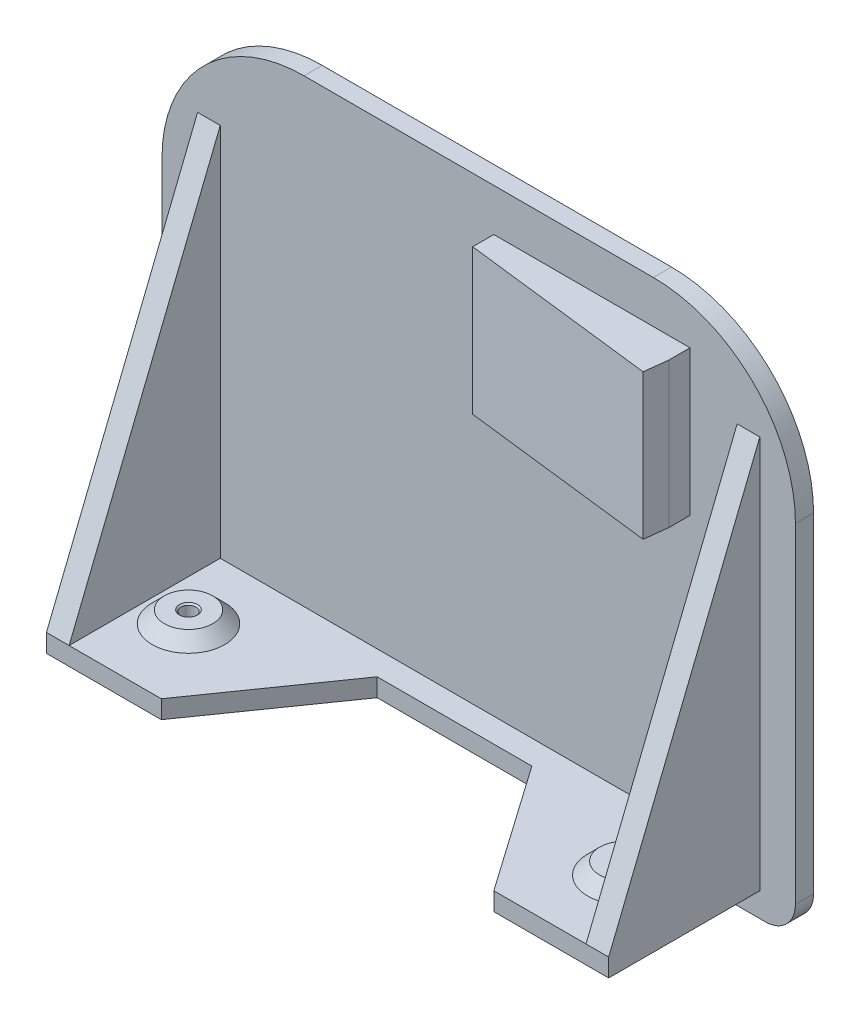
ISO-10303-21;
HEADER;
FILE_DESCRIPTION(('STEP AP214'),'2;1');
FILE_NAME('part.step','',(''),(''),'','','');
FILE_SCHEMA(('AUTOMOTIVE_DESIGN { 1 0 10303 214 1 1 1 1 }'));
ENDSEC;
DATA;
#1=APPLICATION_CONTEXT('core data for automotive mechanical design processes');
#2=APPLICATION_PROTOCOL_DEFINITION('international standard','automotive_design',2000,#1);
#3=PRODUCT_CONTEXT('',#1,'mechanical');
#4=PRODUCT('Part','Part','',(#3));
#5=PRODUCT_RELATED_PRODUCT_CATEGORY('part','',(#4));
#6=PRODUCT_DEFINITION_FORMATION('','',#4);
#7=PRODUCT_DEFINITION_CONTEXT('part definition',#1,'design');
#8=PRODUCT_DEFINITION('design','',#6,#7);
#9=PRODUCT_DEFINITION_SHAPE('','',#8);
#10=(LENGTH_UNIT() NAMED_UNIT(*) SI_UNIT(.MILLI.,.METRE.));
#11=(NAMED_UNIT(*) PLANE_ANGLE_UNIT() SI_UNIT($,.RADIAN.));
#12=(NAMED_UNIT(*) SI_UNIT($,.STERADIAN.) SOLID_ANGLE_UNIT());
#13=UNCERTAINTY_MEASURE_WITH_UNIT(LENGTH_MEASURE(1.E-05),#10,'distance_accuracy_value','');
#14=(GEOMETRIC_REPRESENTATION_CONTEXT(3) GLOBAL_UNCERTAINTY_ASSIGNED_CONTEXT((#13)) GLOBAL_UNIT_ASSIGNED_CONTEXT((#10,
#11,#12)) REPRESENTATION_CONTEXT('',''));
#15=CARTESIAN_POINT('',(0.,0.,0.));
#16=DIRECTION('',(0.,0.,1.));
#17=DIRECTION('',(1.,0.,0.));
#18=AXIS2_PLACEMENT_3D('',#15,#16,#17);
#19=CARTESIAN_POINT('',(-47.3875,-32.,3.));
#20=DIRECTION('',(0.,0.,1.));
#21=DIRECTION('',(1.,0.,0.));
#22=AXIS2_PLACEMENT_3D('',#19,#20,#21);
#23=PLANE('',#22);
#24=DIRECTION('',(0.,-1.,0.));
#25=VECTOR('',#24,1.);
#26=CARTESIAN_POINT('',(-52.3875,0.,3.));
#27=LINE('',#26,#25);
#28=CARTESIAN_POINT('',(-52.3875,22.5375,3.));
#29=VERTEX_POINT('',#28);
#30=CARTESIAN_POINT('',(-52.3875,-32.,3.));
#31=VERTEX_POINT('',#30);
#32=EDGE_CURVE('E348',#29,#31,#27,.T.);
#33=ORIENTED_EDGE('',*,*,#32,.T.);
#34=CARTESIAN_POINT('',(-47.3875,-32.,3.));
#35=DIRECTION('',(0.,0.,1.));
#36=DIRECTION('',(1.,0.,0.));
#37=AXIS2_PLACEMENT_3D('',#34,#35,#36);
#38=CIRCLE('',#37,4.99999999999999);
#39=CARTESIAN_POINT('',(-47.3875,-37.,3.));
#40=VERTEX_POINT('',#39);
#41=EDGE_CURVE('E351',#31,#40,#38,.T.);
#42=ORIENTED_EDGE('',*,*,#41,.T.);
#43=DIRECTION('',(1.,0.,0.));
#44=VECTOR('',#43,1.);
#45=CARTESIAN_POINT('',(-47.3875,-37.,3.));
#46=LINE('',#45,#44);
#47=CARTESIAN_POINT('',(47.3875,-37.,3.));
#48=VERTEX_POINT('',#47);
#49=EDGE_CURVE('E354',#40,#48,#46,.T.);
#50=ORIENTED_EDGE('',*,*,#49,.T.);
#51=CARTESIAN_POINT('',(47.3875,-32.,3.));
#52=DIRECTION('',(0.,0.,1.));
#53=DIRECTION('',(-1.,0.,0.));
#54=AXIS2_PLACEMENT_3D('',#51,#52,#53);
#55=CIRCLE('',#54,4.99999999999999);
#56=CARTESIAN_POINT('',(52.3875,-32.,3.));
#57=VERTEX_POINT('',#56);
#58=EDGE_CURVE('E356',#48,#57,#55,.T.);
#59=ORIENTED_EDGE('',*,*,#58,.T.);
#60=DIRECTION('',(0.,1.,0.));
#61=VECTOR('',#60,1.);
#62=CARTESIAN_POINT('',(52.3875,0.,3.));
#63=LINE('',#62,#61);
#64=CARTESIAN_POINT('',(52.3875,22.5375,3.));
#65=VERTEX_POINT('',#64);
#66=EDGE_CURVE('E358',#57,#65,#63,.T.);
#67=ORIENTED_EDGE('',*,*,#66,.T.);
#68=CARTESIAN_POINT('',(28.8875,22.5375,3.));
#69=DIRECTION('',(0.,0.,1.));
#70=DIRECTION('',(-1.,0.,0.));
#71=AXIS2_PLACEMENT_3D('',#68,#69,#70);
#72=CIRCLE('',#71,23.5);
#73=CARTESIAN_POINT('',(28.8875,46.0375,3.));
#74=VERTEX_POINT('',#73);
#75=EDGE_CURVE('E360',#65,#74,#72,.T.);
#76=ORIENTED_EDGE('',*,*,#75,.T.);
#77=DIRECTION('',(-1.,0.,0.));
#78=VECTOR('',#77,1.);
#79=CARTESIAN_POINT('',(-28.8875,46.0375,3.));
#80=LINE('',#79,#78);
#81=CARTESIAN_POINT('',(-28.8875,46.0375,3.));
#82=VERTEX_POINT('',#81);
#83=EDGE_CURVE('E362',#74,#82,#80,.T.);
#84=ORIENTED_EDGE('',*,*,#83,.T.);
#85=CARTESIAN_POINT('',(-28.8875,22.5375,3.));
#86=DIRECTION('',(0.,0.,1.));
#87=DIRECTION('',(1.,0.,0.));
#88=AXIS2_PLACEMENT_3D('',#85,#86,#87);
#89=CIRCLE('',#88,23.5);
#90=EDGE_CURVE('E364',#82,#29,#89,.T.);
#91=ORIENTED_EDGE('',*,*,#90,.T.);
#92=EDGE_LOOP('',(#33,#42,#50,#59,#67,#76,#84,#91));
#93=FACE_BOUND('',#92,.T.);
#94=DIRECTION('',(-1.,0.,0.));
#95=VECTOR('',#94,1.);
#96=CARTESIAN_POINT('',(46.5,-33.,2.99999999999999));
#97=LINE('',#96,#95);
#98=CARTESIAN_POINT('',(46.5,-33.,2.99999999999999));
#99=VERTEX_POINT('',#98);
#100=CARTESIAN_POINT('',(-46.5,-33.,2.99999999999999));
#101=VERTEX_POINT('',#100);
#102=EDGE_CURVE('E336',#99,#101,#97,.T.);
#103=ORIENTED_EDGE('',*,*,#102,.T.);
#104=DIRECTION('',(0.,1.,0.));
#105=VECTOR('',#104,1.);
#106=CARTESIAN_POINT('',(-46.5,32.,3.));
#107=LINE('',#106,#105);
#108=CARTESIAN_POINT('',(-46.5,32.,3.));
#109=VERTEX_POINT('',#108);
#110=EDGE_CURVE('E316',#101,#109,#107,.T.);
#111=ORIENTED_EDGE('',*,*,#110,.T.);
#112=DIRECTION('',(-1.,0.,0.));
#113=VECTOR('',#112,1.);
#114=CARTESIAN_POINT('',(46.5,32.,3.));
#115=LINE('',#114,#113);
#116=CARTESIAN_POINT('',(-42.75,32.,3.));
#117=VERTEX_POINT('',#116);
#118=EDGE_CURVE('E322',#117,#109,#115,.T.);
#119=ORIENTED_EDGE('',*,*,#118,.F.);
#120=DIRECTION('',(0.,1.,0.));
#121=VECTOR('',#120,1.);
#122=CARTESIAN_POINT('',(-42.75,-30.,2.99999999999999));
#123=LINE('',#122,#121);
#124=CARTESIAN_POINT('',(-42.75,-30.,2.99999999999999));
#125=VERTEX_POINT('',#124);
#126=EDGE_CURVE('E296',#125,#117,#123,.T.);
#127=ORIENTED_EDGE('',*,*,#126,.F.);
#128=DIRECTION('',(1.,0.,0.));
#129=VECTOR('',#128,1.);
#130=CARTESIAN_POINT('',(-42.75,-30.,2.99999999999999));
#131=LINE('',#130,#129);
#132=CARTESIAN_POINT('',(42.75,-30.,2.99999999999999));
#133=VERTEX_POINT('',#132);
#134=EDGE_CURVE('E306',#125,#133,#131,.T.);
#135=ORIENTED_EDGE('',*,*,#134,.T.);
#136=DIRECTION('',(0.,1.,0.));
#137=VECTOR('',#136,1.);
#138=CARTESIAN_POINT('',(42.75,-30.,2.99999999999999));
#139=LINE('',#138,#137);
#140=CARTESIAN_POINT('',(42.75,32.,3.));
#141=VERTEX_POINT('',#140);
#142=EDGE_CURVE('E293',#133,#141,#139,.T.);
#143=ORIENTED_EDGE('',*,*,#142,.T.);
#144=CARTESIAN_POINT('',(46.5,32.,3.));
#145=VERTEX_POINT('',#144);
#146=EDGE_CURVE('E333',#145,#141,#115,.T.);
#147=ORIENTED_EDGE('',*,*,#146,.F.);
#148=DIRECTION('',(0.,1.,0.));
#149=VECTOR('',#148,1.);
#150=CARTESIAN_POINT('',(46.5,32.,3.));
#151=LINE('',#150,#149);
#152=EDGE_CURVE('E320',#99,#145,#151,.T.);
#153=ORIENTED_EDGE('',*,*,#152,.F.);
#154=EDGE_LOOP('',(#103,#111,#119,#127,#135,#143,#147,#153));
#155=FACE_BOUND('',#154,.T.);
#156=DIRECTION('',(0.,-1.,0.));
#157=VECTOR('',#156,1.);
#158=CARTESIAN_POINT('',(2.5,39.,2.99999999999999));
#159=LINE('',#158,#157);
#160=CARTESIAN_POINT('',(2.5,39.,3.));
#161=VERTEX_POINT('',#160);
#162=CARTESIAN_POINT('',(2.5,15.,3.));
#163=VERTEX_POINT('',#162);
#164=EDGE_CURVE('E63',#161,#163,#159,.T.);
#165=ORIENTED_EDGE('',*,*,#164,.F.);
#166=DIRECTION('',(-1.,0.,0.));
#167=VECTOR('',#166,1.);
#168=CARTESIAN_POINT('',(2.5,39.,2.99999999999999));
#169=LINE('',#168,#167);
#170=CARTESIAN_POINT('',(34.9550029038217,39.,3.));
#171=VERTEX_POINT('',#170);
#172=EDGE_CURVE('E67',#171,#161,#169,.T.);
#173=ORIENTED_EDGE('',*,*,#172,.F.);
#174=DIRECTION('',(0.,-1.,0.));
#175=VECTOR('',#174,1.);
#176=CARTESIAN_POINT('',(34.9550029038217,39.,2.99999999999999));
#177=LINE('',#176,#175);
#178=CARTESIAN_POINT('',(34.9550029038217,15.,2.99999999999999));
#179=VERTEX_POINT('',#178);
#180=EDGE_CURVE('E790',#171,#179,#177,.T.);
#181=ORIENTED_EDGE('',*,*,#180,.T.);
#182=DIRECTION('',(-1.,0.,0.));
#183=VECTOR('',#182,1.);
#184=CARTESIAN_POINT('',(2.5,15.,2.99999999999999));
#185=LINE('',#184,#183);
#186=EDGE_CURVE('E223',#179,#163,#185,.T.);
#187=ORIENTED_EDGE('',*,*,#186,.T.);
#188=EDGE_LOOP('',(#165,#173,#181,#187));
#189=FACE_BOUND('',#188,.T.);
#190=ADVANCED_FACE('F47',(#93,#155,#189),#23,.T.);
#191=CARTESIAN_POINT('',(46.5,-33.,28.));
#192=DIRECTION('',(0.,0.,-1.));
#193=DIRECTION('',(-1.,0.,0.));
#194=AXIS2_PLACEMENT_3D('',#191,#192,#193);
#195=PLANE('',#194);
#196=DIRECTION('',(-1.,0.,0.));
#197=VECTOR('',#196,1.);
#198=CARTESIAN_POINT('',(46.5,-33.,28.));
#199=LINE('',#198,#197);
#200=CARTESIAN_POINT('',(-27.5,-33.,28.));
#201=VERTEX_POINT('',#200);
#202=CARTESIAN_POINT('',(-46.5,-33.,28.));
#203=VERTEX_POINT('',#202);
#204=EDGE_CURVE('E339',#201,#203,#199,.T.);
#205=ORIENTED_EDGE('',*,*,#204,.F.);
#206=DIRECTION('',(0.,1.,0.));
#207=VECTOR('',#206,1.);
#208=CARTESIAN_POINT('',(-27.5,-37.,28.));
#209=LINE('',#208,#207);
#210=CARTESIAN_POINT('',(-27.5,-30.,28.));
#211=VERTEX_POINT('',#210);
#212=EDGE_CURVE('E242',#201,#211,#209,.T.);
#213=ORIENTED_EDGE('',*,*,#212,.T.);
#214=DIRECTION('',(1.,0.,0.));
#215=VECTOR('',#214,1.);
#216=CARTESIAN_POINT('',(-42.75,-30.,28.));
#217=LINE('',#216,#215);
#218=CARTESIAN_POINT('',(-42.75,-30.,28.));
#219=VERTEX_POINT('',#218);
#220=EDGE_CURVE('E309',#219,#211,#217,.T.);
#221=ORIENTED_EDGE('',*,*,#220,.F.);
#222=DIRECTION('',(-1.,0.,0.));
#223=VECTOR('',#222,1.);
#224=CARTESIAN_POINT('',(46.5,-30.,28.));
#225=LINE('',#224,#223);
#226=CARTESIAN_POINT('',(-46.5,-30.,28.));
#227=VERTEX_POINT('',#226);
#228=EDGE_CURVE('E343',#219,#227,#225,.T.);
#229=ORIENTED_EDGE('',*,*,#228,.T.);
#230=DIRECTION('',(0.,-1.,0.));
#231=VECTOR('',#230,1.);
#232=CARTESIAN_POINT('',(-46.5,-33.,28.));
#233=LINE('',#232,#231);
#234=EDGE_CURVE('E325',#227,#203,#233,.T.);
#235=ORIENTED_EDGE('',*,*,#234,.T.);
#236=EDGE_LOOP('',(#205,#213,#221,#229,#235));
#237=FACE_BOUND('',#236,.T.);
#238=ADVANCED_FACE('F432',(#237),#195,.F.);
#239=CARTESIAN_POINT('',(46.5,-30.,28.));
#240=DIRECTION('',(0.,-0.37396833549694,-0.927441472032412));
#241=DIRECTION('',(0.,0.927441472032412,-0.37396833549694));
#242=AXIS2_PLACEMENT_3D('',#239,#240,#241);
#243=PLANE('',#242);
#244=DIRECTION('',(0.,-0.927441472032412,0.37396833549694));
#245=VECTOR('',#244,1.);
#246=CARTESIAN_POINT('',(-42.75,32.,3.));
#247=LINE('',#246,#245);
#248=EDGE_CURVE('E290',#117,#219,#247,.T.);
#249=ORIENTED_EDGE('',*,*,#248,.F.);
#250=ORIENTED_EDGE('',*,*,#118,.T.);
#251=DIRECTION('',(0.,-0.927441472032412,0.37396833549694));
#252=VECTOR('',#251,1.);
#253=CARTESIAN_POINT('',(-46.5,-30.,28.));
#254=LINE('',#253,#252);
#255=EDGE_CURVE('E308',#109,#227,#254,.T.);
#256=ORIENTED_EDGE('',*,*,#255,.T.);
#257=ORIENTED_EDGE('',*,*,#228,.F.);
#258=EDGE_LOOP('',(#249,#250,#256,#257));
#259=FACE_BOUND('',#258,.T.);
#260=ADVANCED_FACE('F438',(#259),#243,.F.);
#261=CARTESIAN_POINT('',(-47.3875,-32.,3.));
#262=DIRECTION('',(0.,0.,-1.));
#263=DIRECTION('',(-1.,0.,0.));
#264=AXIS2_PLACEMENT_3D('',#261,#262,#263);
#265=CYLINDRICAL_SURFACE('',#264,4.99999999999999);
#266=CARTESIAN_POINT('',(-47.3875,-32.,0.));
#267=DIRECTION('',(0.,0.,1.));
#268=DIRECTION('',(1.,0.,0.));
#269=AXIS2_PLACEMENT_3D('',#266,#267,#268);
#270=CIRCLE('',#269,4.99999999999999);
#271=CARTESIAN_POINT('',(-52.3875,-32.,0.));
#272=VERTEX_POINT('',#271);
#273=CARTESIAN_POINT('',(-47.3875,-37.,0.));
#274=VERTEX_POINT('',#273);
#275=EDGE_CURVE('E347',#272,#274,#270,.T.);
#276=ORIENTED_EDGE('',*,*,#275,.T.);
#277=DIRECTION('',(0.,0.,-1.));
#278=VECTOR('',#277,1.);
#279=CARTESIAN_POINT('',(-47.3875,-37.,3.));
#280=LINE('',#279,#278);
#281=EDGE_CURVE('E400',#40,#274,#280,.T.);
#282=ORIENTED_EDGE('',*,*,#281,.F.);
#283=ORIENTED_EDGE('',*,*,#41,.F.);
#284=DIRECTION('',(0.,0.,-1.));
#285=VECTOR('',#284,1.);
#286=CARTESIAN_POINT('',(-52.3875,-32.,3.));
#287=LINE('',#286,#285);
#288=EDGE_CURVE('E403',#31,#272,#287,.T.);
#289=ORIENTED_EDGE('',*,*,#288,.T.);
#290=EDGE_LOOP('',(#276,#282,#283,#289));
#291=FACE_BOUND('',#290,.T.);
#292=ADVANCED_FACE('F477',(#291),#265,.T.);
#293=CARTESIAN_POINT('',(-47.3875,-37.,3.));
#294=DIRECTION('',(0.,1.,0.));
#295=DIRECTION('',(-1.,0.,0.));
#296=AXIS2_PLACEMENT_3D('',#293,#294,#295);
#297=PLANE('',#296);
#298=DIRECTION('',(1.,0.,0.));
#299=VECTOR('',#298,1.);
#300=CARTESIAN_POINT('',(-47.3875,-37.,0.));
#301=LINE('',#300,#299);
#302=CARTESIAN_POINT('',(47.3875,-37.,0.));
#303=VERTEX_POINT('',#302);
#304=EDGE_CURVE('E369',#274,#303,#301,.T.);
#305=ORIENTED_EDGE('',*,*,#304,.T.);
#306=DIRECTION('',(0.,0.,-1.));
#307=VECTOR('',#306,1.);
#308=CARTESIAN_POINT('',(47.3875,-37.,3.));
#309=LINE('',#308,#307);
#310=EDGE_CURVE('E397',#48,#303,#309,.T.);
#311=ORIENTED_EDGE('',*,*,#310,.F.);
#312=ORIENTED_EDGE('',*,*,#49,.F.);
#313=ORIENTED_EDGE('',*,*,#281,.T.);
#314=EDGE_LOOP('',(#305,#311,#312,#313));
#315=FACE_BOUND('',#314,.T.);
#316=ADVANCED_FACE('F473',(#315),#297,.F.);
#317=CARTESIAN_POINT('',(47.3875,-32.,3.));
#318=DIRECTION('',(0.,0.,-1.));
#319=DIRECTION('',(-1.,0.,0.));
#320=AXIS2_PLACEMENT_3D('',#317,#318,#319);
#321=CYLINDRICAL_SURFACE('',#320,4.99999999999999);
#322=CARTESIAN_POINT('',(47.3875,-32.,0.));
#323=DIRECTION('',(0.,0.,1.));
#324=DIRECTION('',(-1.,0.,0.));
#325=AXIS2_PLACEMENT_3D('',#322,#323,#324);
#326=CIRCLE('',#325,4.99999999999999);
#327=CARTESIAN_POINT('',(52.3875,-32.,0.));
#328=VERTEX_POINT('',#327);
#329=EDGE_CURVE('E371',#303,#328,#326,.T.);
#330=ORIENTED_EDGE('',*,*,#329,.T.);
#331=DIRECTION('',(0.,0.,-1.));
#332=VECTOR('',#331,1.);
#333=CARTESIAN_POINT('',(52.3875,-32.,3.));
#334=LINE('',#333,#332);
#335=EDGE_CURVE('E394',#57,#328,#334,.T.);
#336=ORIENTED_EDGE('',*,*,#335,.F.);
#337=ORIENTED_EDGE('',*,*,#58,.F.);
#338=ORIENTED_EDGE('',*,*,#310,.T.);
#339=EDGE_LOOP('',(#330,#336,#337,#338));
#340=FACE_BOUND('',#339,.T.);
#341=ADVANCED_FACE('F469',(#340),#321,.T.);
#342=CARTESIAN_POINT('',(52.3875,22.5375,3.));
#343=DIRECTION('',(-1.,0.,0.));
#344=DIRECTION('',(0.,-1.,0.));
#345=AXIS2_PLACEMENT_3D('',#342,#343,#344);
#346=PLANE('',#345);
#347=DIRECTION('',(0.,1.,0.));
#348=VECTOR('',#347,1.);
#349=CARTESIAN_POINT('',(52.3875,22.5375,0.));
#350=LINE('',#349,#348);
#351=CARTESIAN_POINT('',(52.3875,22.5375,0.));
#352=VERTEX_POINT('',#351);
#353=EDGE_CURVE('E374',#328,#352,#350,.T.);
#354=ORIENTED_EDGE('',*,*,#353,.T.);
#355=DIRECTION('',(0.,0.,-1.));
#356=VECTOR('',#355,1.);
#357=CARTESIAN_POINT('',(52.3875,22.5375,3.));
#358=LINE('',#357,#356);
#359=EDGE_CURVE('E391',#65,#352,#358,.T.);
#360=ORIENTED_EDGE('',*,*,#359,.F.);
#361=ORIENTED_EDGE('',*,*,#66,.F.);
#362=ORIENTED_EDGE('',*,*,#335,.T.);
#363=EDGE_LOOP('',(#354,#360,#361,#362));
#364=FACE_BOUND('',#363,.T.);
#365=ADVANCED_FACE('F465',(#364),#346,.F.);
#366=CARTESIAN_POINT('',(28.8875,22.5375,3.));
#367=DIRECTION('',(0.,0.,-1.));
#368=DIRECTION('',(-1.,0.,0.));
#369=AXIS2_PLACEMENT_3D('',#366,#367,#368);
#370=CYLINDRICAL_SURFACE('',#369,23.5);
#371=CARTESIAN_POINT('',(28.8875,22.5375,0.));
#372=DIRECTION('',(0.,0.,1.));
#373=DIRECTION('',(-1.,0.,0.));
#374=AXIS2_PLACEMENT_3D('',#371,#372,#373);
#375=CIRCLE('',#374,23.5);
#376=CARTESIAN_POINT('',(28.8875,46.0375,0.));
#377=VERTEX_POINT('',#376);
#378=EDGE_CURVE('E376',#352,#377,#375,.T.);
#379=ORIENTED_EDGE('',*,*,#378,.T.);
#380=DIRECTION('',(0.,0.,-1.));
#381=VECTOR('',#380,1.);
#382=CARTESIAN_POINT('',(28.8875,46.0375,3.));
#383=LINE('',#382,#381);
#384=EDGE_CURVE('E388',#74,#377,#383,.T.);
#385=ORIENTED_EDGE('',*,*,#384,.F.);
#386=ORIENTED_EDGE('',*,*,#75,.F.);
#387=ORIENTED_EDGE('',*,*,#359,.T.);
#388=EDGE_LOOP('',(#379,#385,#386,#387));
#389=FACE_BOUND('',#388,.T.);
#390=ADVANCED_FACE('F461',(#389),#370,.T.);
#391=CARTESIAN_POINT('',(-28.8875,46.0375,3.));
#392=DIRECTION('',(0.,-1.,0.));
#393=DIRECTION('',(1.,0.,0.));
#394=AXIS2_PLACEMENT_3D('',#391,#392,#393);
#395=PLANE('',#394);
#396=DIRECTION('',(-1.,0.,0.));
#397=VECTOR('',#396,1.);
#398=CARTESIAN_POINT('',(-28.8875,46.0375,0.));
#399=LINE('',#398,#397);
#400=CARTESIAN_POINT('',(-28.8875,46.0375,0.));
#401=VERTEX_POINT('',#400);
#402=EDGE_CURVE('E378',#377,#401,#399,.T.);
#403=ORIENTED_EDGE('',*,*,#402,.T.);
#404=DIRECTION('',(0.,0.,-1.));
#405=VECTOR('',#404,1.);
#406=CARTESIAN_POINT('',(-28.8875,46.0375,3.));
#407=LINE('',#406,#405);
#408=EDGE_CURVE('E385',#82,#401,#407,.T.);
#409=ORIENTED_EDGE('',*,*,#408,.F.);
#410=ORIENTED_EDGE('',*,*,#83,.F.);
#411=ORIENTED_EDGE('',*,*,#384,.T.);
#412=EDGE_LOOP('',(#403,#409,#410,#411));
#413=FACE_BOUND('',#412,.T.);
#414=ADVANCED_FACE('F457',(#413),#395,.F.);
#415=CARTESIAN_POINT('',(-28.8875,22.5375,3.));
#416=DIRECTION('',(0.,0.,-1.));
#417=DIRECTION('',(-1.,0.,0.));
#418=AXIS2_PLACEMENT_3D('',#415,#416,#417);
#419=CYLINDRICAL_SURFACE('',#418,23.5);
#420=CARTESIAN_POINT('',(-28.8875,22.5375,0.));
#421=DIRECTION('',(0.,0.,1.));
#422=DIRECTION('',(1.,0.,0.));
#423=AXIS2_PLACEMENT_3D('',#420,#421,#422);
#424=CIRCLE('',#423,23.5);
#425=CARTESIAN_POINT('',(-52.3875,22.5375,0.));
#426=VERTEX_POINT('',#425);
#427=EDGE_CURVE('E380',#401,#426,#424,.T.);
#428=ORIENTED_EDGE('',*,*,#427,.T.);
#429=DIRECTION('',(0.,0.,-1.));
#430=VECTOR('',#429,1.);
#431=CARTESIAN_POINT('',(-52.3875,22.5375,3.));
#432=LINE('',#431,#430);
#433=EDGE_CURVE('E367',#29,#426,#432,.T.);
#434=ORIENTED_EDGE('',*,*,#433,.F.);
#435=ORIENTED_EDGE('',*,*,#90,.F.);
#436=ORIENTED_EDGE('',*,*,#408,.T.);
#437=EDGE_LOOP('',(#428,#434,#435,#436));
#438=FACE_BOUND('',#437,.T.);
#439=ADVANCED_FACE('F453',(#438),#419,.T.);
#440=CARTESIAN_POINT('',(-52.3875,22.5375,3.));
#441=DIRECTION('',(1.,0.,0.));
#442=DIRECTION('',(0.,1.,0.));
#443=AXIS2_PLACEMENT_3D('',#440,#441,#442);
#444=PLANE('',#443);
#445=DIRECTION('',(0.,-1.,0.));
#446=VECTOR('',#445,1.);
#447=CARTESIAN_POINT('',(-52.3875,22.5375,0.));
#448=LINE('',#447,#446);
#449=EDGE_CURVE('E352',#426,#272,#448,.T.);
#450=ORIENTED_EDGE('',*,*,#449,.T.);
#451=ORIENTED_EDGE('',*,*,#288,.F.);
#452=ORIENTED_EDGE('',*,*,#32,.F.);
#453=ORIENTED_EDGE('',*,*,#433,.T.);
#454=EDGE_LOOP('',(#450,#451,#452,#453));
#455=FACE_BOUND('',#454,.T.);
#456=ADVANCED_FACE('F449',(#455),#444,.F.);
#457=CARTESIAN_POINT('',(-47.3875,-32.,0.));
#458=DIRECTION('',(0.,0.,1.));
#459=DIRECTION('',(1.,0.,0.));
#460=AXIS2_PLACEMENT_3D('',#457,#458,#459);
#461=PLANE('',#460);
#462=ORIENTED_EDGE('',*,*,#275,.F.);
#463=ORIENTED_EDGE('',*,*,#449,.F.);
#464=ORIENTED_EDGE('',*,*,#427,.F.);
#465=ORIENTED_EDGE('',*,*,#402,.F.);
#466=ORIENTED_EDGE('',*,*,#378,.F.);
#467=ORIENTED_EDGE('',*,*,#353,.F.);
#468=ORIENTED_EDGE('',*,*,#329,.F.);
#469=ORIENTED_EDGE('',*,*,#304,.F.);
#470=EDGE_LOOP('',(#462,#463,#464,#465,#466,#467,#468,#469));
#471=FACE_BOUND('',#470,.T.);
#472=ADVANCED_FACE('F446',(#471),#461,.F.);
#473=ORIENTED_EDGE('',*,*,#146,.T.);
#474=DIRECTION('',(0.,-0.927441472032412,0.37396833549694));
#475=VECTOR('',#474,1.);
#476=CARTESIAN_POINT('',(42.75,32.,3.));
#477=LINE('',#476,#475);
#478=CARTESIAN_POINT('',(42.75,-30.,28.));
#479=VERTEX_POINT('',#478);
#480=EDGE_CURVE('E289',#141,#479,#477,.T.);
#481=ORIENTED_EDGE('',*,*,#480,.T.);
#482=CARTESIAN_POINT('',(46.5,-30.,28.));
#483=VERTEX_POINT('',#482);
#484=EDGE_CURVE('E344',#483,#479,#225,.T.);
#485=ORIENTED_EDGE('',*,*,#484,.F.);
#486=DIRECTION('',(0.,-0.927441472032412,0.37396833549694));
#487=VECTOR('',#486,1.);
#488=CARTESIAN_POINT('',(46.5,-30.,28.));
#489=LINE('',#488,#487);
#490=EDGE_CURVE('E312',#145,#483,#489,.T.);
#491=ORIENTED_EDGE('',*,*,#490,.F.);
#492=EDGE_LOOP('',(#473,#481,#485,#491));
#493=FACE_BOUND('',#492,.T.);
#494=ADVANCED_FACE('F445',(#493),#243,.F.);
#495=CARTESIAN_POINT('',(27.5,-30.,28.));
#496=VERTEX_POINT('',#495);
#497=EDGE_CURVE('E298',#496,#479,#217,.T.);
#498=ORIENTED_EDGE('',*,*,#497,.F.);
#499=DIRECTION('',(0.,1.,0.));
#500=VECTOR('',#499,1.);
#501=CARTESIAN_POINT('',(27.5,-37.,28.));
#502=LINE('',#501,#500);
#503=CARTESIAN_POINT('',(27.5,-33.,28.));
#504=VERTEX_POINT('',#503);
#505=EDGE_CURVE('E241',#504,#496,#502,.T.);
#506=ORIENTED_EDGE('',*,*,#505,.F.);
#507=CARTESIAN_POINT('',(46.5,-33.,28.));
#508=VERTEX_POINT('',#507);
#509=EDGE_CURVE('E340',#508,#504,#199,.T.);
#510=ORIENTED_EDGE('',*,*,#509,.F.);
#511=DIRECTION('',(0.,-1.,0.));
#512=VECTOR('',#511,1.);
#513=CARTESIAN_POINT('',(46.5,-33.,28.));
#514=LINE('',#513,#512);
#515=EDGE_CURVE('E315',#483,#508,#514,.T.);
#516=ORIENTED_EDGE('',*,*,#515,.F.);
#517=ORIENTED_EDGE('',*,*,#484,.T.);
#518=EDGE_LOOP('',(#498,#506,#510,#516,#517));
#519=FACE_BOUND('',#518,.T.);
#520=ADVANCED_FACE('F441',(#519),#195,.F.);
#521=CARTESIAN_POINT('',(46.5,-33.,2.99999999999999));
#522=DIRECTION('',(0.,1.,0.));
#523=DIRECTION('',(0.,0.,1.));
#524=AXIS2_PLACEMENT_3D('',#521,#522,#523);
#525=PLANE('',#524);
#526=CARTESIAN_POINT('',(36.,-33.,15.));
#527=DIRECTION('',(0.,-1.,0.));
#528=DIRECTION('',(0.,0.,-1.));
#529=AXIS2_PLACEMENT_3D('',#526,#527,#528);
#530=CIRCLE('',#529,1.5);
#531=CARTESIAN_POINT('',(36.,-33.,13.5));
#532=VERTEX_POINT('',#531);
#533=EDGE_CURVE('E262',#532,#532,#530,.T.);
#534=ORIENTED_EDGE('',*,*,#533,.F.);
#535=EDGE_LOOP('',(#534));
#536=FACE_BOUND('',#535,.T.);
#537=CARTESIAN_POINT('',(-36.,-33.,15.));
#538=DIRECTION('',(0.,-1.,0.));
#539=DIRECTION('',(0.,0.,-1.));
#540=AXIS2_PLACEMENT_3D('',#537,#538,#539);
#541=CIRCLE('',#540,1.5);
#542=CARTESIAN_POINT('',(-36.,-33.,13.5));
#543=VERTEX_POINT('',#542);
#544=EDGE_CURVE('E274',#543,#543,#541,.T.);
#545=ORIENTED_EDGE('',*,*,#544,.F.);
#546=EDGE_LOOP('',(#545));
#547=FACE_BOUND('',#546,.T.);
#548=DIRECTION('',(-1.,0.,0.));
#549=VECTOR('',#548,1.);
#550=CARTESIAN_POINT('',(46.5,-33.,6.99999999999998));
#551=LINE('',#550,#549);
#552=CARTESIAN_POINT('',(12.795641697596,-33.,6.99999999999999));
#553=VERTEX_POINT('',#552);
#554=CARTESIAN_POINT('',(-12.795641697596,-33.,6.99999999999999));
#555=VERTEX_POINT('',#554);
#556=EDGE_CURVE('E253',#553,#555,#551,.T.);
#557=ORIENTED_EDGE('',*,*,#556,.T.);
#558=DIRECTION('',(-0.573576436351049,0.,0.81915204428899));
#559=VECTOR('',#558,1.);
#560=CARTESIAN_POINT('',(8.59141245677442,-33.,-23.5438787606495));
#561=LINE('',#560,#559);
#562=EDGE_CURVE('E256',#555,#201,#561,.T.);
#563=ORIENTED_EDGE('',*,*,#562,.T.);
#564=ORIENTED_EDGE('',*,*,#204,.T.);
#565=DIRECTION('',(0.,0.,-1.));
#566=VECTOR('',#565,1.);
#567=CARTESIAN_POINT('',(-46.5,-33.,2.99999999999999));
#568=LINE('',#567,#566);
#569=EDGE_CURVE('E328',#203,#101,#568,.T.);
#570=ORIENTED_EDGE('',*,*,#569,.T.);
#571=ORIENTED_EDGE('',*,*,#102,.F.);
#572=DIRECTION('',(0.,0.,-1.));
#573=VECTOR('',#572,1.);
#574=CARTESIAN_POINT('',(46.5,-33.,2.99999999999999));
#575=LINE('',#574,#573);
#576=EDGE_CURVE('E318',#508,#99,#575,.T.);
#577=ORIENTED_EDGE('',*,*,#576,.F.);
#578=ORIENTED_EDGE('',*,*,#509,.T.);
#579=DIRECTION('',(-0.57357643635105,0.,-0.819152044288989));
#580=VECTOR('',#579,1.);
#581=CARTESIAN_POINT('',(22.0046508785823,-33.,20.1518281058954));
#582=LINE('',#581,#580);
#583=EDGE_CURVE('E245',#504,#553,#582,.T.);
#584=ORIENTED_EDGE('',*,*,#583,.T.);
#585=EDGE_LOOP('',(#557,#563,#564,#570,#571,#577,#578,#584));
#586=FACE_BOUND('',#585,.T.);
#587=ADVANCED_FACE('F519',(#536,#547,#586),#525,.F.);
#588=CARTESIAN_POINT('',(46.5,0.,0.));
#589=DIRECTION('',(1.,0.,0.));
#590=DIRECTION('',(0.,0.,-1.));
#591=AXIS2_PLACEMENT_3D('',#588,#589,#590);
#592=PLANE('',#591);
#593=ORIENTED_EDGE('',*,*,#490,.T.);
#594=ORIENTED_EDGE('',*,*,#515,.T.);
#595=ORIENTED_EDGE('',*,*,#576,.T.);
#596=ORIENTED_EDGE('',*,*,#152,.T.);
#597=EDGE_LOOP('',(#593,#594,#595,#596));
#598=FACE_BOUND('',#597,.T.);
#599=ADVANCED_FACE('F537',(#598),#592,.T.);
#600=CARTESIAN_POINT('',(-46.5,0.,0.));
#601=DIRECTION('',(1.,0.,0.));
#602=DIRECTION('',(0.,0.,-1.));
#603=AXIS2_PLACEMENT_3D('',#600,#601,#602);
#604=PLANE('',#603);
#605=ORIENTED_EDGE('',*,*,#255,.F.);
#606=ORIENTED_EDGE('',*,*,#110,.F.);
#607=ORIENTED_EDGE('',*,*,#569,.F.);
#608=ORIENTED_EDGE('',*,*,#234,.F.);
#609=EDGE_LOOP('',(#605,#606,#607,#608));
#610=FACE_BOUND('',#609,.T.);
#611=ADVANCED_FACE('F544',(#610),#604,.F.);
#612=CARTESIAN_POINT('',(-42.75,-30.,28.));
#613=DIRECTION('',(0.,-1.,0.));
#614=DIRECTION('',(0.,0.,-1.));
#615=AXIS2_PLACEMENT_3D('',#612,#613,#614);
#616=PLANE('',#615);
#617=CARTESIAN_POINT('',(36.,-30.,15.));
#618=DIRECTION('',(0.,-1.,0.));
#619=DIRECTION('',(0.,0.,-1.));
#620=AXIS2_PLACEMENT_3D('',#617,#618,#619);
#621=CIRCLE('',#620,5.99999999999995);
#622=CARTESIAN_POINT('',(36.,-30.,9.00000000000005));
#623=VERTEX_POINT('',#622);
#624=EDGE_CURVE('E11',#623,#623,#621,.T.);
#625=ORIENTED_EDGE('',*,*,#624,.T.);
#626=EDGE_LOOP('',(#625));
#627=FACE_BOUND('',#626,.T.);
#628=CARTESIAN_POINT('',(-36.,-30.,15.));
#629=DIRECTION('',(0.,-1.,0.));
#630=DIRECTION('',(0.,0.,-1.));
#631=AXIS2_PLACEMENT_3D('',#628,#629,#630);
#632=CIRCLE('',#631,5.99999999999995);
#633=CARTESIAN_POINT('',(-36.,-30.,9.00000000000005));
#634=VERTEX_POINT('',#633);
#635=EDGE_CURVE('E56',#634,#634,#632,.T.);
#636=ORIENTED_EDGE('',*,*,#635,.T.);
#637=EDGE_LOOP('',(#636));
#638=FACE_BOUND('',#637,.T.);
#639=ORIENTED_EDGE('',*,*,#220,.T.);
#640=DIRECTION('',(-0.573576436351049,0.,0.819152044288989));
#641=VECTOR('',#640,1.);
#642=CARTESIAN_POINT('',(-27.5,-30.,28.));
#643=LINE('',#642,#641);
#644=CARTESIAN_POINT('',(-12.795641697596,-30.,6.99999999999999));
#645=VERTEX_POINT('',#644);
#646=EDGE_CURVE('E239',#645,#211,#643,.T.);
#647=ORIENTED_EDGE('',*,*,#646,.F.);
#648=DIRECTION('',(-1.,0.,0.));
#649=VECTOR('',#648,1.);
#650=CARTESIAN_POINT('',(-12.795641697596,-30.,6.99999999999999));
#651=LINE('',#650,#649);
#652=CARTESIAN_POINT('',(12.795641697596,-30.,6.99999999999999));
#653=VERTEX_POINT('',#652);
#654=EDGE_CURVE('E231',#653,#645,#651,.T.);
#655=ORIENTED_EDGE('',*,*,#654,.F.);
#656=DIRECTION('',(-0.57357643635105,0.,-0.819152044288989));
#657=VECTOR('',#656,1.);
#658=CARTESIAN_POINT('',(12.795641697596,-30.,6.99999999999999));
#659=LINE('',#658,#657);
#660=EDGE_CURVE('E228',#496,#653,#659,.T.);
#661=ORIENTED_EDGE('',*,*,#660,.F.);
#662=ORIENTED_EDGE('',*,*,#497,.T.);
#663=DIRECTION('',(0.,0.,-1.));
#664=VECTOR('',#663,1.);
#665=CARTESIAN_POINT('',(42.75,-30.,28.));
#666=LINE('',#665,#664);
#667=EDGE_CURVE('E301',#479,#133,#666,.T.);
#668=ORIENTED_EDGE('',*,*,#667,.T.);
#669=ORIENTED_EDGE('',*,*,#134,.F.);
#670=DIRECTION('',(0.,0.,-1.));
#671=VECTOR('',#670,1.);
#672=CARTESIAN_POINT('',(-42.75,-30.,28.));
#673=LINE('',#672,#671);
#674=EDGE_CURVE('E292',#219,#125,#673,.T.);
#675=ORIENTED_EDGE('',*,*,#674,.F.);
#676=EDGE_LOOP('',(#639,#647,#655,#661,#662,#668,#669,#675));
#677=FACE_BOUND('',#676,.T.);
#678=ADVANCED_FACE('F408',(#627,#638,#677),#616,.F.);
#679=CARTESIAN_POINT('',(-42.75,0.,0.));
#680=DIRECTION('',(1.,0.,0.));
#681=DIRECTION('',(0.,0.,-1.));
#682=AXIS2_PLACEMENT_3D('',#679,#680,#681);
#683=PLANE('',#682);
#684=ORIENTED_EDGE('',*,*,#248,.T.);
#685=ORIENTED_EDGE('',*,*,#674,.T.);
#686=ORIENTED_EDGE('',*,*,#126,.T.);
#687=EDGE_LOOP('',(#684,#685,#686));
#688=FACE_BOUND('',#687,.T.);
#689=ADVANCED_FACE('F549',(#688),#683,.T.);
#690=CARTESIAN_POINT('',(42.75,0.,0.));
#691=DIRECTION('',(1.,0.,0.));
#692=DIRECTION('',(0.,0.,-1.));
#693=AXIS2_PLACEMENT_3D('',#690,#691,#692);
#694=PLANE('',#693);
#695=ORIENTED_EDGE('',*,*,#480,.F.);
#696=ORIENTED_EDGE('',*,*,#142,.F.);
#697=ORIENTED_EDGE('',*,*,#667,.F.);
#698=EDGE_LOOP('',(#695,#696,#697));
#699=FACE_BOUND('',#698,.T.);
#700=ADVANCED_FACE('F427',(#699),#694,.F.);
#701=CARTESIAN_POINT('',(36.,-28.,15.));
#702=DIRECTION('',(0.,1.,0.));
#703=DIRECTION('',(0.,0.,1.));
#704=AXIS2_PLACEMENT_3D('',#701,#702,#703);
#705=PLANE('',#704);
#706=CARTESIAN_POINT('',(36.,-28.,15.));
#707=DIRECTION('',(0.,-1.,0.));
#708=DIRECTION('',(0.,0.,-1.));
#709=AXIS2_PLACEMENT_3D('',#706,#707,#708);
#710=CIRCLE('',#709,1.5);
#711=CARTESIAN_POINT('',(36.,-28.,13.5));
#712=VERTEX_POINT('',#711);
#713=EDGE_CURVE('E259',#712,#712,#710,.T.);
#714=ORIENTED_EDGE('',*,*,#713,.T.);
#715=EDGE_LOOP('',(#714));
#716=FACE_BOUND('',#715,.T.);
#717=CARTESIAN_POINT('',(36.,-28.,15.));
#718=DIRECTION('',(0.,1.,0.));
#719=DIRECTION('',(0.,0.,1.));
#720=AXIS2_PLACEMENT_3D('',#717,#718,#719);
#721=CIRCLE('',#720,4.);
#722=CARTESIAN_POINT('',(36.,-28.,19.));
#723=VERTEX_POINT('',#722);
#724=EDGE_CURVE('E286',#723,#723,#721,.T.);
#725=ORIENTED_EDGE('',*,*,#724,.T.);
#726=EDGE_LOOP('',(#725));
#727=FACE_BOUND('',#726,.T.);
#728=ADVANCED_FACE('F419',(#716,#727),#705,.T.);
#729=CARTESIAN_POINT('',(-36.,-28.,15.));
#730=DIRECTION('',(0.,1.,0.));
#731=DIRECTION('',(0.,0.,1.));
#732=AXIS2_PLACEMENT_3D('',#729,#730,#731);
#733=PLANE('',#732);
#734=CARTESIAN_POINT('',(-36.,-28.,15.));
#735=DIRECTION('',(0.,-1.,0.));
#736=DIRECTION('',(0.,0.,-1.));
#737=AXIS2_PLACEMENT_3D('',#734,#735,#736);
#738=CIRCLE('',#737,1.5);
#739=CARTESIAN_POINT('',(-36.,-28.,13.5));
#740=VERTEX_POINT('',#739);
#741=EDGE_CURVE('E271',#740,#740,#738,.T.);
#742=ORIENTED_EDGE('',*,*,#741,.T.);
#743=EDGE_LOOP('',(#742));
#744=FACE_BOUND('',#743,.T.);
#745=CARTESIAN_POINT('',(-36.,-28.,15.));
#746=DIRECTION('',(0.,1.,0.));
#747=DIRECTION('',(0.,0.,1.));
#748=AXIS2_PLACEMENT_3D('',#745,#746,#747);
#749=CIRCLE('',#748,4.);
#750=CARTESIAN_POINT('',(-36.,-28.,19.));
#751=VERTEX_POINT('',#750);
#752=EDGE_CURVE('E283',#751,#751,#749,.T.);
#753=ORIENTED_EDGE('',*,*,#752,.T.);
#754=EDGE_LOOP('',(#753));
#755=FACE_BOUND('',#754,.T.);
#756=ADVANCED_FACE('F417',(#744,#755),#733,.T.);
#757=CARTESIAN_POINT('',(36.,-28.,15.));
#758=DIRECTION('',(0.,-1.,0.));
#759=DIRECTION('',(0.,0.,-1.));
#760=AXIS2_PLACEMENT_3D('',#757,#758,#759);
#761=CONICAL_SURFACE('',#760,4.,0.785398163397445);
#762=ORIENTED_EDGE('',*,*,#624,.F.);
#763=EDGE_LOOP('',(#762));
#764=FACE_BOUND('',#763,.T.);
#765=ORIENTED_EDGE('',*,*,#724,.F.);
#766=EDGE_LOOP('',(#765));
#767=FACE_BOUND('',#766,.T.);
#768=ADVANCED_FACE('F414',(#764,#767),#761,.T.);
#769=CARTESIAN_POINT('',(-36.,-28.,15.));
#770=DIRECTION('',(0.,-1.,0.));
#771=DIRECTION('',(0.,0.,-1.));
#772=AXIS2_PLACEMENT_3D('',#769,#770,#771);
#773=CONICAL_SURFACE('',#772,4.,0.785398163397445);
#774=ORIENTED_EDGE('',*,*,#635,.F.);
#775=EDGE_LOOP('',(#774));
#776=FACE_BOUND('',#775,.T.);
#777=ORIENTED_EDGE('',*,*,#752,.F.);
#778=EDGE_LOOP('',(#777));
#779=FACE_BOUND('',#778,.T.);
#780=ADVANCED_FACE('F50',(#776,#779),#773,.T.);
#781=CARTESIAN_POINT('',(-36.,-28.25,15.));
#782=DIRECTION('',(0.,1.,0.));
#783=DIRECTION('',(0.,0.,1.));
#784=AXIS2_PLACEMENT_3D('',#781,#782,#783);
#785=CONICAL_SURFACE('',#784,1.25,0.785398163397448);
#786=ORIENTED_EDGE('',*,*,#741,.F.);
#787=EDGE_LOOP('',(#786));
#788=FACE_BOUND('',#787,.T.);
#789=CARTESIAN_POINT('',(-36.,-28.25,15.));
#790=DIRECTION('',(0.,-1.,0.));
#791=DIRECTION('',(0.,0.,-1.));
#792=AXIS2_PLACEMENT_3D('',#789,#790,#791);
#793=CIRCLE('',#792,1.25);
#794=CARTESIAN_POINT('',(-36.,-28.25,13.75));
#795=VERTEX_POINT('',#794);
#796=EDGE_CURVE('E280',#795,#795,#793,.T.);
#797=ORIENTED_EDGE('',*,*,#796,.T.);
#798=EDGE_LOOP('',(#797));
#799=FACE_BOUND('',#798,.T.);
#800=ADVANCED_FACE('F413',(#788,#799),#785,.F.);
#801=CARTESIAN_POINT('',(-36.,-33.,15.));
#802=DIRECTION('',(0.,-1.,0.));
#803=DIRECTION('',(0.,0.,-1.));
#804=AXIS2_PLACEMENT_3D('',#801,#802,#803);
#805=CYLINDRICAL_SURFACE('',#804,1.25);
#806=ORIENTED_EDGE('',*,*,#796,.F.);
#807=EDGE_LOOP('',(#806));
#808=FACE_BOUND('',#807,.T.);
#809=CARTESIAN_POINT('',(-36.,-32.75,15.));
#810=DIRECTION('',(0.,-1.,0.));
#811=DIRECTION('',(0.,0.,-1.));
#812=AXIS2_PLACEMENT_3D('',#809,#810,#811);
#813=CIRCLE('',#812,1.25);
#814=CARTESIAN_POINT('',(-36.,-32.75,13.75));
#815=VERTEX_POINT('',#814);
#816=EDGE_CURVE('E277',#815,#815,#813,.T.);
#817=ORIENTED_EDGE('',*,*,#816,.T.);
#818=EDGE_LOOP('',(#817));
#819=FACE_BOUND('',#818,.T.);
#820=ADVANCED_FACE('F585',(#808,#819),#805,.F.);
#821=CARTESIAN_POINT('',(-36.,-33.,15.));
#822=DIRECTION('',(0.,-1.,0.));
#823=DIRECTION('',(0.,0.,-1.));
#824=AXIS2_PLACEMENT_3D('',#821,#822,#823);
#825=CONICAL_SURFACE('',#824,1.5,0.785398163397448);
#826=ORIENTED_EDGE('',*,*,#816,.F.);
#827=EDGE_LOOP('',(#826));
#828=FACE_BOUND('',#827,.T.);
#829=ORIENTED_EDGE('',*,*,#544,.T.);
#830=EDGE_LOOP('',(#829));
#831=FACE_BOUND('',#830,.T.);
#832=ADVANCED_FACE('F581',(#828,#831),#825,.F.);
#833=CARTESIAN_POINT('',(36.,-28.25,15.));
#834=DIRECTION('',(0.,1.,0.));
#835=DIRECTION('',(0.,0.,1.));
#836=AXIS2_PLACEMENT_3D('',#833,#834,#835);
#837=CONICAL_SURFACE('',#836,1.25,0.785398163397448);
#838=ORIENTED_EDGE('',*,*,#713,.F.);
#839=EDGE_LOOP('',(#838));
#840=FACE_BOUND('',#839,.T.);
#841=CARTESIAN_POINT('',(36.,-28.25,15.));
#842=DIRECTION('',(0.,-1.,0.));
#843=DIRECTION('',(0.,0.,-1.));
#844=AXIS2_PLACEMENT_3D('',#841,#842,#843);
#845=CIRCLE('',#844,1.25);
#846=CARTESIAN_POINT('',(36.,-28.25,13.75));
#847=VERTEX_POINT('',#846);
#848=EDGE_CURVE('E268',#847,#847,#845,.T.);
#849=ORIENTED_EDGE('',*,*,#848,.T.);
#850=EDGE_LOOP('',(#849));
#851=FACE_BOUND('',#850,.T.);
#852=ADVANCED_FACE('F577',(#840,#851),#837,.F.);
#853=CARTESIAN_POINT('',(36.,-33.,15.));
#854=DIRECTION('',(0.,-1.,0.));
#855=DIRECTION('',(0.,0.,-1.));
#856=AXIS2_PLACEMENT_3D('',#853,#854,#855);
#857=CYLINDRICAL_SURFACE('',#856,1.25);
#858=ORIENTED_EDGE('',*,*,#848,.F.);
#859=EDGE_LOOP('',(#858));
#860=FACE_BOUND('',#859,.T.);
#861=CARTESIAN_POINT('',(36.,-32.75,15.));
#862=DIRECTION('',(0.,-1.,0.));
#863=DIRECTION('',(0.,0.,-1.));
#864=AXIS2_PLACEMENT_3D('',#861,#862,#863);
#865=CIRCLE('',#864,1.25);
#866=CARTESIAN_POINT('',(36.,-32.75,13.75));
#867=VERTEX_POINT('',#866);
#868=EDGE_CURVE('E265',#867,#867,#865,.T.);
#869=ORIENTED_EDGE('',*,*,#868,.T.);
#870=EDGE_LOOP('',(#869));
#871=FACE_BOUND('',#870,.T.);
#872=ADVANCED_FACE('F573',(#860,#871),#857,.F.);
#873=CARTESIAN_POINT('',(36.,-33.,15.));
#874=DIRECTION('',(0.,-1.,0.));
#875=DIRECTION('',(0.,0.,-1.));
#876=AXIS2_PLACEMENT_3D('',#873,#874,#875);
#877=CONICAL_SURFACE('',#876,1.5,0.785398163397448);
#878=ORIENTED_EDGE('',*,*,#868,.F.);
#879=EDGE_LOOP('',(#878));
#880=FACE_BOUND('',#879,.T.);
#881=ORIENTED_EDGE('',*,*,#533,.T.);
#882=EDGE_LOOP('',(#881));
#883=FACE_BOUND('',#882,.T.);
#884=ADVANCED_FACE('F570',(#880,#883),#877,.F.);
#885=CARTESIAN_POINT('',(-27.5,-37.,28.));
#886=DIRECTION('',(-0.81915204428899,0.,-0.573576436351049));
#887=DIRECTION('',(-0.573576436351049,0.,0.81915204428899));
#888=AXIS2_PLACEMENT_3D('',#885,#886,#887);
#889=PLANE('',#888);
#890=DIRECTION('',(0.,1.,0.));
#891=VECTOR('',#890,1.);
#892=CARTESIAN_POINT('',(-12.795641697596,-37.,6.99999999999999));
#893=LINE('',#892,#891);
#894=EDGE_CURVE('E246',#555,#645,#893,.T.);
#895=ORIENTED_EDGE('',*,*,#894,.T.);
#896=ORIENTED_EDGE('',*,*,#646,.T.);
#897=ORIENTED_EDGE('',*,*,#212,.F.);
#898=ORIENTED_EDGE('',*,*,#562,.F.);
#899=EDGE_LOOP('',(#895,#896,#897,#898));
#900=FACE_BOUND('',#899,.T.);
#901=ADVANCED_FACE('F553',(#900),#889,.F.);
#902=CARTESIAN_POINT('',(-12.795641697596,-37.,6.99999999999999));
#903=DIRECTION('',(0.,0.,-1.));
#904=DIRECTION('',(-1.,0.,0.));
#905=AXIS2_PLACEMENT_3D('',#902,#903,#904);
#906=PLANE('',#905);
#907=DIRECTION('',(0.,1.,0.));
#908=VECTOR('',#907,1.);
#909=CARTESIAN_POINT('',(12.795641697596,-37.,6.99999999999999));
#910=LINE('',#909,#908);
#911=EDGE_CURVE('E248',#553,#653,#910,.T.);
#912=ORIENTED_EDGE('',*,*,#911,.T.);
#913=ORIENTED_EDGE('',*,*,#654,.T.);
#914=ORIENTED_EDGE('',*,*,#894,.F.);
#915=ORIENTED_EDGE('',*,*,#556,.F.);
#916=EDGE_LOOP('',(#912,#913,#914,#915));
#917=FACE_BOUND('',#916,.T.);
#918=ADVANCED_FACE('F557',(#917),#906,.F.);
#919=CARTESIAN_POINT('',(12.795641697596,-37.,6.99999999999999));
#920=DIRECTION('',(0.819152044288989,0.,-0.57357643635105));
#921=DIRECTION('',(-0.57357643635105,0.,-0.819152044288989));
#922=AXIS2_PLACEMENT_3D('',#919,#920,#921);
#923=PLANE('',#922);
#924=ORIENTED_EDGE('',*,*,#505,.T.);
#925=ORIENTED_EDGE('',*,*,#660,.T.);
#926=ORIENTED_EDGE('',*,*,#911,.F.);
#927=ORIENTED_EDGE('',*,*,#583,.F.);
#928=EDGE_LOOP('',(#924,#925,#926,#927));
#929=FACE_BOUND('',#928,.T.);
#930=ADVANCED_FACE('F559',(#929),#923,.F.);
#931=CARTESIAN_POINT('',(2.5,39.,6.49999999999999));
#932=DIRECTION('',(1.,0.,0.));
#933=DIRECTION('',(0.,0.,-1.));
#934=AXIS2_PLACEMENT_3D('',#931,#932,#933);
#935=PLANE('',#934);
#936=DIRECTION('',(0.,0.,1.));
#937=VECTOR('',#936,1.);
#938=CARTESIAN_POINT('',(2.5,15.,6.49999999999999));
#939=LINE('',#938,#937);
#940=CARTESIAN_POINT('',(2.5,15.,6.49999999999999));
#941=VERTEX_POINT('',#940);
#942=EDGE_CURVE('E227',#163,#941,#939,.T.);
#943=ORIENTED_EDGE('',*,*,#942,.T.);
#944=DIRECTION('',(0.,-1.,0.));
#945=VECTOR('',#944,1.);
#946=CARTESIAN_POINT('',(2.5,39.,6.49999999999999));
#947=LINE('',#946,#945);
#948=CARTESIAN_POINT('',(2.5,39.,6.49999999999999));
#949=VERTEX_POINT('',#948);
#950=EDGE_CURVE('E211',#949,#941,#947,.T.);
#951=ORIENTED_EDGE('',*,*,#950,.F.);
#952=DIRECTION('',(0.,0.,1.));
#953=VECTOR('',#952,1.);
#954=CARTESIAN_POINT('',(2.5,39.,6.49999999999999));
#955=LINE('',#954,#953);
#956=EDGE_CURVE('E218',#161,#949,#955,.T.);
#957=ORIENTED_EDGE('',*,*,#956,.F.);
#958=ORIENTED_EDGE('',*,*,#164,.T.);
#959=EDGE_LOOP('',(#943,#951,#957,#958));
#960=FACE_BOUND('',#959,.T.);
#961=ADVANCED_FACE('F225',(#960),#935,.F.);
#962=CARTESIAN_POINT('',(2.5,39.,6.49999999999999));
#963=DIRECTION('',(0.118403968306494,0.,-0.992965508106538));
#964=DIRECTION('',(-0.992965508106538,0.,-0.118403968306494));
#965=AXIS2_PLACEMENT_3D('',#962,#963,#964);
#966=PLANE('',#965);
#967=DIRECTION('',(0.992965508106538,0.,0.118403968306494));
#968=VECTOR('',#967,1.);
#969=CARTESIAN_POINT('',(2.5,15.,6.49999999999999));
#970=LINE('',#969,#968);
#971=CARTESIAN_POINT('',(34.5,15.,10.3157689817774));
#972=VERTEX_POINT('',#971);
#973=EDGE_CURVE('E777',#941,#972,#970,.T.);
#974=ORIENTED_EDGE('',*,*,#973,.T.);
#975=DIRECTION('',(0.,-1.,0.));
#976=VECTOR('',#975,1.);
#977=CARTESIAN_POINT('',(34.5,39.,10.3157689817774));
#978=LINE('',#977,#976);
#979=CARTESIAN_POINT('',(34.5,39.,10.3157689817774));
#980=VERTEX_POINT('',#979);
#981=EDGE_CURVE('E214',#980,#972,#978,.T.);
#982=ORIENTED_EDGE('',*,*,#981,.F.);
#983=DIRECTION('',(0.992965508106538,0.,0.118403968306494));
#984=VECTOR('',#983,1.);
#985=CARTESIAN_POINT('',(2.5,39.,6.49999999999999));
#986=LINE('',#985,#984);
#987=EDGE_CURVE('E207',#949,#980,#986,.T.);
#988=ORIENTED_EDGE('',*,*,#987,.F.);
#989=ORIENTED_EDGE('',*,*,#950,.T.);
#990=EDGE_LOOP('',(#974,#982,#988,#989));
#991=FACE_BOUND('',#990,.T.);
#992=ADVANCED_FACE('F209',(#991),#966,.F.);
#993=CARTESIAN_POINT('',(34.5,39.,10.3157689817774));
#994=DIRECTION('',(-0.992965508106538,0.,-0.118403968306494));
#995=DIRECTION('',(-0.118403968306494,0.,0.992965508106538));
#996=AXIS2_PLACEMENT_3D('',#993,#994,#995);
#997=PLANE('',#996);
#998=DIRECTION('',(0.118403968306494,0.,-0.992965508106538));
#999=VECTOR('',#998,1.);
#1000=CARTESIAN_POINT('',(34.5,15.,10.3157689817774));
#1001=LINE('',#1000,#999);
#1002=CARTESIAN_POINT('',(34.9550029038217,15.,6.49999999999999));
#1003=VERTEX_POINT('',#1002);
#1004=EDGE_CURVE('E779',#972,#1003,#1001,.T.);
#1005=ORIENTED_EDGE('',*,*,#1004,.T.);
#1006=DIRECTION('',(0.,-1.,0.));
#1007=VECTOR('',#1006,1.);
#1008=CARTESIAN_POINT('',(34.9550029038217,39.,6.49999999999999));
#1009=LINE('',#1008,#1007);
#1010=CARTESIAN_POINT('',(34.9550029038217,39.,6.49999999999999));
#1011=VERTEX_POINT('',#1010);
#1012=EDGE_CURVE('E233',#1011,#1003,#1009,.T.);
#1013=ORIENTED_EDGE('',*,*,#1012,.F.);
#1014=DIRECTION('',(0.118403968306494,0.,-0.992965508106538));
#1015=VECTOR('',#1014,1.);
#1016=CARTESIAN_POINT('',(34.5,39.,10.3157689817774));
#1017=LINE('',#1016,#1015);
#1018=EDGE_CURVE('E217',#980,#1011,#1017,.T.);
#1019=ORIENTED_EDGE('',*,*,#1018,.F.);
#1020=ORIENTED_EDGE('',*,*,#981,.T.);
#1021=EDGE_LOOP('',(#1005,#1013,#1019,#1020));
#1022=FACE_BOUND('',#1021,.T.);
#1023=ADVANCED_FACE('F733',(#1022),#997,.F.);
#1024=CARTESIAN_POINT('',(34.9550029038217,39.,2.99999999999999));
#1025=DIRECTION('',(-1.,0.,0.));
#1026=DIRECTION('',(0.,0.,1.));
#1027=AXIS2_PLACEMENT_3D('',#1024,#1025,#1026);
#1028=PLANE('',#1027);
#1029=DIRECTION('',(0.,0.,-1.));
#1030=VECTOR('',#1029,1.);
#1031=CARTESIAN_POINT('',(34.9550029038217,15.,2.99999999999999));
#1032=LINE('',#1031,#1030);
#1033=EDGE_CURVE('E785',#1003,#179,#1032,.T.);
#1034=ORIENTED_EDGE('',*,*,#1033,.T.);
#1035=ORIENTED_EDGE('',*,*,#180,.F.);
#1036=DIRECTION('',(0.,0.,-1.));
#1037=VECTOR('',#1036,1.);
#1038=CARTESIAN_POINT('',(34.9550029038217,39.,2.99999999999999));
#1039=LINE('',#1038,#1037);
#1040=EDGE_CURVE('E795',#1011,#171,#1039,.T.);
#1041=ORIENTED_EDGE('',*,*,#1040,.F.);
#1042=ORIENTED_EDGE('',*,*,#1012,.T.);
#1043=EDGE_LOOP('',(#1034,#1035,#1041,#1042));
#1044=FACE_BOUND('',#1043,.T.);
#1045=ADVANCED_FACE('F742',(#1044),#1028,.F.);
#1046=CARTESIAN_POINT('',(0.,39.,0.));
#1047=DIRECTION('',(0.,-1.,0.));
#1048=DIRECTION('',(0.,0.,-1.));
#1049=AXIS2_PLACEMENT_3D('',#1046,#1047,#1048);
#1050=PLANE('',#1049);
#1051=ORIENTED_EDGE('',*,*,#956,.T.);
#1052=ORIENTED_EDGE('',*,*,#987,.T.);
#1053=ORIENTED_EDGE('',*,*,#1018,.T.);
#1054=ORIENTED_EDGE('',*,*,#1040,.T.);
#1055=ORIENTED_EDGE('',*,*,#172,.T.);
#1056=EDGE_LOOP('',(#1051,#1052,#1053,#1054,#1055));
#1057=FACE_BOUND('',#1056,.T.);
#1058=ADVANCED_FACE('F221',(#1057),#1050,.F.);
#1059=CARTESIAN_POINT('',(0.,15.,0.));
#1060=DIRECTION('',(0.,-1.,0.));
#1061=DIRECTION('',(0.,0.,-1.));
#1062=AXIS2_PLACEMENT_3D('',#1059,#1060,#1061);
#1063=PLANE('',#1062);
#1064=ORIENTED_EDGE('',*,*,#942,.F.);
#1065=ORIENTED_EDGE('',*,*,#186,.F.);
#1066=ORIENTED_EDGE('',*,*,#1033,.F.);
#1067=ORIENTED_EDGE('',*,*,#1004,.F.);
#1068=ORIENTED_EDGE('',*,*,#973,.F.);
#1069=EDGE_LOOP('',(#1064,#1065,#1066,#1067,#1068));
#1070=FACE_BOUND('',#1069,.T.);
#1071=ADVANCED_FACE('F761',(#1070),#1063,.T.);
#1072=CLOSED_SHELL('',(#190,#238,#260,#292,#316,#341,#365,#390,#414,#439,#456,#472,#494,#520,
#587,#599,#611,#678,#689,#700,#728,#756,#768,#780,#800,#820,#832,#852,#872,#884,#901,#918,#930,
#961,#992,#1023,#1045,#1058,#1071));
#1073=MANIFOLD_SOLID_BREP('B2',#1072);
#1074=ADVANCED_BREP_SHAPE_REPRESENTATION('',(#18,#1073),#14);
#1075=SHAPE_DEFINITION_REPRESENTATION(#9,#1074);
ENDSEC;
END-ISO-10303-21;
